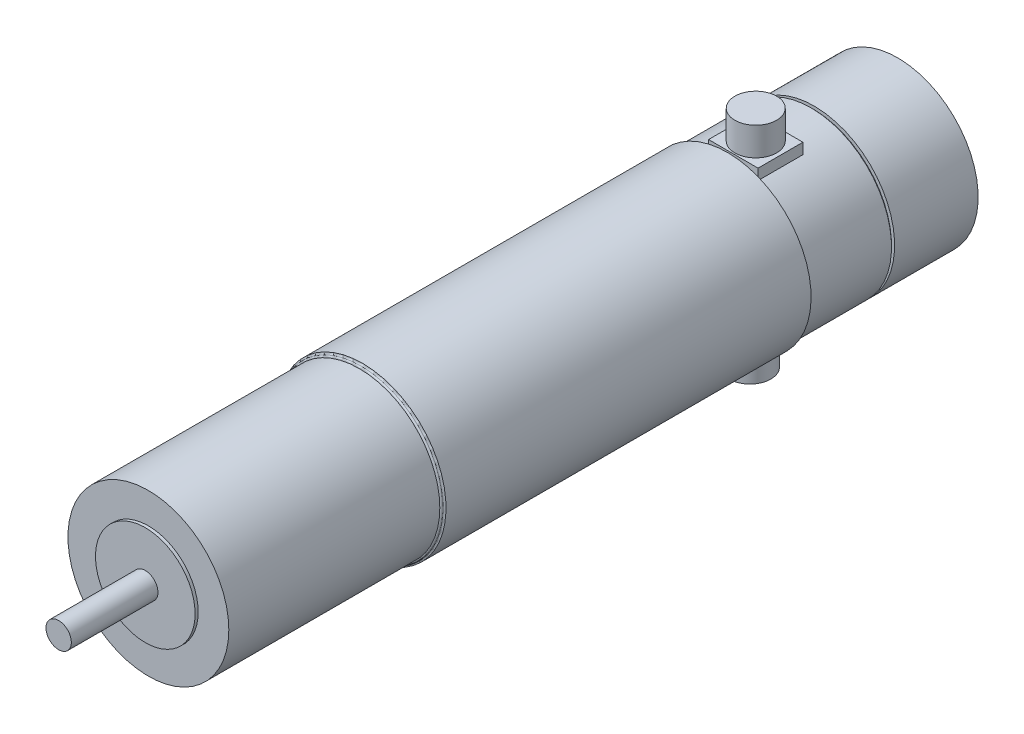
ISO-10303-21;
HEADER;
FILE_DESCRIPTION(('STEP AP214'),'2;1');
FILE_NAME('part.step','',(''),(''),'','','');
FILE_SCHEMA(('AUTOMOTIVE_DESIGN { 1 0 10303 214 1 1 1 1 }'));
ENDSEC;
DATA;
#1=APPLICATION_CONTEXT('core data for automotive mechanical design processes');
#2=APPLICATION_PROTOCOL_DEFINITION('international standard','automotive_design',2000,#1);
#3=PRODUCT_CONTEXT('',#1,'mechanical');
#4=PRODUCT('Part','Part','',(#3));
#5=PRODUCT_RELATED_PRODUCT_CATEGORY('part','',(#4));
#6=PRODUCT_DEFINITION_FORMATION('','',#4);
#7=PRODUCT_DEFINITION_CONTEXT('part definition',#1,'design');
#8=PRODUCT_DEFINITION('design','',#6,#7);
#9=PRODUCT_DEFINITION_SHAPE('','',#8);
#10=(LENGTH_UNIT() NAMED_UNIT(*) SI_UNIT(.MILLI.,.METRE.));
#11=(NAMED_UNIT(*) PLANE_ANGLE_UNIT() SI_UNIT($,.RADIAN.));
#12=(NAMED_UNIT(*) SI_UNIT($,.STERADIAN.) SOLID_ANGLE_UNIT());
#13=UNCERTAINTY_MEASURE_WITH_UNIT(LENGTH_MEASURE(1.E-05),#10,'distance_accuracy_value','');
#14=(GEOMETRIC_REPRESENTATION_CONTEXT(3) GLOBAL_UNCERTAINTY_ASSIGNED_CONTEXT((#13)) GLOBAL_UNIT_ASSIGNED_CONTEXT((#10,
#11,#12)) REPRESENTATION_CONTEXT('',''));
#15=CARTESIAN_POINT('',(0.,0.,0.));
#16=DIRECTION('',(0.,0.,1.));
#17=DIRECTION('',(1.,0.,0.));
#18=AXIS2_PLACEMENT_3D('',#15,#16,#17);
#19=CARTESIAN_POINT('',(0.,0.,-153.1));
#20=DIRECTION('',(0.,0.,-1.));
#21=DIRECTION('',(-1.,0.,0.));
#22=AXIS2_PLACEMENT_3D('',#19,#20,#21);
#23=PLANE('',#22);
#24=CARTESIAN_POINT('',(0.,0.,-153.1));
#25=DIRECTION('',(0.,0.,-1.));
#26=DIRECTION('',(-1.,0.,0.));
#27=AXIS2_PLACEMENT_3D('',#24,#25,#26);
#28=CIRCLE('',#27,27.);
#29=CARTESIAN_POINT('',(9.86076186383501,25.1349433153277,-153.1));
#30=VERTEX_POINT('',#29);
#31=CARTESIAN_POINT('',(8.00000000000002,-25.7875939164552,-153.1));
#32=VERTEX_POINT('',#31);
#33=EDGE_CURVE('E207',#30,#32,#28,.T.);
#34=ORIENTED_EDGE('',*,*,#33,.T.);
#35=DIRECTION('',(0.,-1.,0.));
#36=VECTOR('',#35,1.);
#37=CARTESIAN_POINT('',(8.00000000000002,27.552,-153.1));
#38=LINE('',#37,#36);
#39=CARTESIAN_POINT('',(8.00000000000002,-24.738633753706,-153.1));
#40=VERTEX_POINT('',#39);
#41=EDGE_CURVE('E512',#40,#32,#38,.T.);
#42=ORIENTED_EDGE('',*,*,#41,.F.);
#43=CARTESIAN_POINT('',(0.,0.,-153.1));
#44=DIRECTION('',(0.,0.,-1.));
#45=DIRECTION('',(-1.,0.,0.));
#46=AXIS2_PLACEMENT_3D('',#43,#44,#45);
#47=CIRCLE('',#46,26.);
#48=CARTESIAN_POINT('',(9.860761863835,24.0575430055677,-153.1));
#49=VERTEX_POINT('',#48);
#50=EDGE_CURVE('E198',#49,#40,#47,.T.);
#51=ORIENTED_EDGE('',*,*,#50,.F.);
#52=DIRECTION('',(0.,1.,0.));
#53=VECTOR('',#52,1.);
#54=CARTESIAN_POINT('',(9.86076186383501,-27.001,-153.1));
#55=LINE('',#54,#53);
#56=EDGE_CURVE('E176',#49,#30,#55,.T.);
#57=ORIENTED_EDGE('',*,*,#56,.T.);
#58=EDGE_LOOP('',(#34,#42,#51,#57));
#59=FACE_BOUND('',#58,.T.);
#60=ADVANCED_FACE('F36',(#59),#23,.T.);
#61=CARTESIAN_POINT('',(-7.99999999999999,-24.738633753706,-153.1));
#62=VERTEX_POINT('',#61);
#63=CARTESIAN_POINT('',(-6.13923813616499,25.2647927976356,-153.1));
#64=VERTEX_POINT('',#63);
#65=EDGE_CURVE('E203',#62,#64,#47,.T.);
#66=ORIENTED_EDGE('',*,*,#65,.F.);
#67=DIRECTION('',(0.,-1.,0.));
#68=VECTOR('',#67,1.);
#69=CARTESIAN_POINT('',(-7.99999999999999,27.552,-153.1));
#70=LINE('',#69,#68);
#71=CARTESIAN_POINT('',(-7.99999999999999,-25.7875939164553,-153.1));
#72=VERTEX_POINT('',#71);
#73=EDGE_CURVE('E53',#62,#72,#70,.T.);
#74=ORIENTED_EDGE('',*,*,#73,.T.);
#75=CARTESIAN_POINT('',(-6.13923813616499,26.2927700158705,-153.1));
#76=VERTEX_POINT('',#75);
#77=EDGE_CURVE('E208',#72,#76,#28,.T.);
#78=ORIENTED_EDGE('',*,*,#77,.T.);
#79=DIRECTION('',(0.,1.,0.));
#80=VECTOR('',#79,1.);
#81=CARTESIAN_POINT('',(-6.13923813616499,-27.001,-153.1));
#82=LINE('',#81,#80);
#83=EDGE_CURVE('E180',#64,#76,#82,.T.);
#84=ORIENTED_EDGE('',*,*,#83,.F.);
#85=EDGE_LOOP('',(#66,#74,#78,#84));
#86=FACE_BOUND('',#85,.T.);
#87=ADVANCED_FACE('F260',(#86),#23,.T.);
#88=CARTESIAN_POINT('',(0.,0.,-180.1));
#89=DIRECTION('',(0.,0.,1.));
#90=DIRECTION('',(1.,0.,0.));
#91=AXIS2_PLACEMENT_3D('',#88,#89,#90);
#92=CYLINDRICAL_SURFACE('',#91,26.);
#93=CARTESIAN_POINT('',(0.,0.,-180.1));
#94=DIRECTION('',(0.,0.,-1.));
#95=DIRECTION('',(-1.,0.,0.));
#96=AXIS2_PLACEMENT_3D('',#93,#94,#95);
#97=CIRCLE('',#96,26.);
#98=CARTESIAN_POINT('',(-26.,0.,-180.1));
#99=VERTEX_POINT('',#98);
#100=EDGE_CURVE('E195',#99,#99,#97,.T.);
#101=ORIENTED_EDGE('',*,*,#100,.F.);
#102=EDGE_LOOP('',(#101));
#103=FACE_BOUND('',#102,.T.);
#104=DIRECTION('',(0.,0.,1.));
#105=VECTOR('',#104,1.);
#106=CARTESIAN_POINT('',(8.00000000000001,-24.738633753706,-180.1));
#107=LINE('',#106,#105);
#108=CARTESIAN_POINT('',(8.00000000000001,-24.738633753706,-167.6));
#109=VERTEX_POINT('',#108);
#110=EDGE_CURVE('E122',#40,#109,#107,.F.);
#111=ORIENTED_EDGE('',*,*,#110,.T.);
#112=CARTESIAN_POINT('',(0.,0.,-167.6));
#113=DIRECTION('',(0.,0.,1.));
#114=DIRECTION('',(1.,0.,0.));
#115=AXIS2_PLACEMENT_3D('',#112,#113,#114);
#116=CIRCLE('',#115,26.);
#117=CARTESIAN_POINT('',(-7.99999999999999,-24.738633753706,-167.6));
#118=VERTEX_POINT('',#117);
#119=EDGE_CURVE('E116',#109,#118,#116,.F.);
#120=ORIENTED_EDGE('',*,*,#119,.T.);
#121=DIRECTION('',(0.,0.,1.));
#122=VECTOR('',#121,1.);
#123=CARTESIAN_POINT('',(-7.99999999999999,-24.738633753706,-180.1));
#124=LINE('',#123,#122);
#125=EDGE_CURVE('E119',#118,#62,#124,.T.);
#126=ORIENTED_EDGE('',*,*,#125,.T.);
#127=ORIENTED_EDGE('',*,*,#65,.T.);
#128=DIRECTION('',(0.,0.,1.));
#129=VECTOR('',#128,1.);
#130=CARTESIAN_POINT('',(-6.13923813616499,25.2647927976356,-180.1));
#131=LINE('',#130,#129);
#132=CARTESIAN_POINT('',(-6.13923813616499,25.2647927976356,-167.6));
#133=VERTEX_POINT('',#132);
#134=EDGE_CURVE('E155',#133,#64,#131,.T.);
#135=ORIENTED_EDGE('',*,*,#134,.F.);
#136=CARTESIAN_POINT('',(0.,0.,-167.6));
#137=DIRECTION('',(0.,0.,-1.));
#138=DIRECTION('',(-1.,0.,0.));
#139=AXIS2_PLACEMENT_3D('',#136,#137,#138);
#140=CIRCLE('',#139,26.);
#141=CARTESIAN_POINT('',(9.860761863835,24.0575430055677,-167.6));
#142=VERTEX_POINT('',#141);
#143=EDGE_CURVE('E159',#142,#133,#140,.F.);
#144=ORIENTED_EDGE('',*,*,#143,.F.);
#145=DIRECTION('',(0.,0.,1.));
#146=VECTOR('',#145,1.);
#147=CARTESIAN_POINT('',(9.860761863835,24.0575430055677,-180.1));
#148=LINE('',#147,#146);
#149=EDGE_CURVE('E158',#49,#142,#148,.F.);
#150=ORIENTED_EDGE('',*,*,#149,.F.);
#151=ORIENTED_EDGE('',*,*,#50,.T.);
#152=EDGE_LOOP('',(#111,#120,#126,#127,#135,#144,#150,#151));
#153=FACE_BOUND('',#152,.T.);
#154=ADVANCED_FACE('F118',(#103,#153),#92,.T.);
#155=CARTESIAN_POINT('',(0.,0.,34.1));
#156=DIRECTION('',(0.,0.,-1.));
#157=DIRECTION('',(-1.,0.,0.));
#158=AXIS2_PLACEMENT_3D('',#155,#156,#157);
#159=CYLINDRICAL_SURFACE('',#158,26.);
#160=CARTESIAN_POINT('',(0.,0.,34.1));
#161=DIRECTION('',(0.,0.,1.));
#162=DIRECTION('',(1.,0.,0.));
#163=AXIS2_PLACEMENT_3D('',#160,#161,#162);
#164=CIRCLE('',#163,26.);
#165=CARTESIAN_POINT('',(26.,0.,34.1));
#166=VERTEX_POINT('',#165);
#167=EDGE_CURVE('E221',#166,#166,#164,.T.);
#168=ORIENTED_EDGE('',*,*,#167,.F.);
#169=EDGE_LOOP('',(#168));
#170=FACE_BOUND('',#169,.T.);
#171=CARTESIAN_POINT('',(0.,0.,-34.1));
#172=DIRECTION('',(0.,0.,1.));
#173=DIRECTION('',(1.,0.,0.));
#174=AXIS2_PLACEMENT_3D('',#171,#172,#173);
#175=CIRCLE('',#174,26.);
#176=CARTESIAN_POINT('',(26.,0.,-34.1));
#177=VERTEX_POINT('',#176);
#178=EDGE_CURVE('E206',#177,#177,#175,.T.);
#179=ORIENTED_EDGE('',*,*,#178,.T.);
#180=EDGE_LOOP('',(#179));
#181=FACE_BOUND('',#180,.T.);
#182=ADVANCED_FACE('F292',(#170,#181),#159,.T.);
#183=CARTESIAN_POINT('',(0.,0.,34.1));
#184=DIRECTION('',(0.,0.,1.));
#185=DIRECTION('',(1.,0.,0.));
#186=AXIS2_PLACEMENT_3D('',#183,#184,#185);
#187=PLANE('',#186);
#188=CARTESIAN_POINT('',(0.,0.,34.1));
#189=DIRECTION('',(0.,0.,1.));
#190=DIRECTION('',(1.,0.,0.));
#191=AXIS2_PLACEMENT_3D('',#188,#189,#190);
#192=CIRCLE('',#191,16.098);
#193=CARTESIAN_POINT('',(16.098,0.,34.1));
#194=VERTEX_POINT('',#193);
#195=EDGE_CURVE('E218',#194,#194,#192,.T.);
#196=ORIENTED_EDGE('',*,*,#195,.F.);
#197=EDGE_LOOP('',(#196));
#198=FACE_BOUND('',#197,.T.);
#199=ORIENTED_EDGE('',*,*,#167,.T.);
#200=EDGE_LOOP('',(#199));
#201=FACE_BOUND('',#200,.T.);
#202=ADVANCED_FACE('F288',(#198,#201),#187,.T.);
#203=CARTESIAN_POINT('',(0.,0.,35.1));
#204=DIRECTION('',(0.,0.,-1.));
#205=DIRECTION('',(-1.,0.,0.));
#206=AXIS2_PLACEMENT_3D('',#203,#204,#205);
#207=CYLINDRICAL_SURFACE('',#206,16.098);
#208=CARTESIAN_POINT('',(0.,0.,35.1));
#209=DIRECTION('',(0.,0.,1.));
#210=DIRECTION('',(1.,0.,0.));
#211=AXIS2_PLACEMENT_3D('',#208,#209,#210);
#212=CIRCLE('',#211,16.098);
#213=CARTESIAN_POINT('',(16.098,0.,35.1));
#214=VERTEX_POINT('',#213);
#215=EDGE_CURVE('E214',#214,#214,#212,.T.);
#216=ORIENTED_EDGE('',*,*,#215,.F.);
#217=EDGE_LOOP('',(#216));
#218=FACE_BOUND('',#217,.T.);
#219=ORIENTED_EDGE('',*,*,#195,.T.);
#220=EDGE_LOOP('',(#219));
#221=FACE_BOUND('',#220,.T.);
#222=ADVANCED_FACE('F284',(#218,#221),#207,.T.);
#223=CARTESIAN_POINT('',(0.,0.,35.1));
#224=DIRECTION('',(0.,0.,1.));
#225=DIRECTION('',(1.,0.,0.));
#226=AXIS2_PLACEMENT_3D('',#223,#224,#225);
#227=PLANE('',#226);
#228=CARTESIAN_POINT('',(0.,0.,35.1));
#229=DIRECTION('',(0.,0.,1.));
#230=DIRECTION('',(1.,0.,0.));
#231=AXIS2_PLACEMENT_3D('',#228,#229,#230);
#232=CIRCLE('',#231,4.09800000000001);
#233=CARTESIAN_POINT('',(4.09800000000001,0.,35.1));
#234=VERTEX_POINT('',#233);
#235=EDGE_CURVE('E215',#234,#234,#232,.T.);
#236=ORIENTED_EDGE('',*,*,#235,.F.);
#237=EDGE_LOOP('',(#236));
#238=FACE_BOUND('',#237,.T.);
#239=ORIENTED_EDGE('',*,*,#215,.T.);
#240=EDGE_LOOP('',(#239));
#241=FACE_BOUND('',#240,.T.);
#242=ADVANCED_FACE('F280',(#238,#241),#227,.T.);
#243=CARTESIAN_POINT('',(0.,0.,63.1));
#244=DIRECTION('',(0.,0.,-1.));
#245=DIRECTION('',(-1.,0.,0.));
#246=AXIS2_PLACEMENT_3D('',#243,#244,#245);
#247=CYLINDRICAL_SURFACE('',#246,4.09800000000001);
#248=CARTESIAN_POINT('',(0.,0.,63.1));
#249=DIRECTION('',(0.,0.,1.));
#250=DIRECTION('',(1.,0.,0.));
#251=AXIS2_PLACEMENT_3D('',#248,#249,#250);
#252=CIRCLE('',#251,4.09800000000001);
#253=CARTESIAN_POINT('',(4.09800000000001,0.,63.1));
#254=VERTEX_POINT('',#253);
#255=EDGE_CURVE('E211',#254,#254,#252,.T.);
#256=ORIENTED_EDGE('',*,*,#255,.F.);
#257=EDGE_LOOP('',(#256));
#258=FACE_BOUND('',#257,.T.);
#259=ORIENTED_EDGE('',*,*,#235,.T.);
#260=EDGE_LOOP('',(#259));
#261=FACE_BOUND('',#260,.T.);
#262=ADVANCED_FACE('F276',(#258,#261),#247,.T.);
#263=CARTESIAN_POINT('',(0.,0.,63.1));
#264=DIRECTION('',(0.,0.,1.));
#265=DIRECTION('',(1.,0.,0.));
#266=AXIS2_PLACEMENT_3D('',#263,#264,#265);
#267=PLANE('',#266);
#268=ORIENTED_EDGE('',*,*,#255,.T.);
#269=EDGE_LOOP('',(#268));
#270=FACE_BOUND('',#269,.T.);
#271=ADVANCED_FACE('F273',(#270),#267,.T.);
#272=CARTESIAN_POINT('',(0.,0.,-153.1));
#273=DIRECTION('',(0.,0.,1.));
#274=DIRECTION('',(1.,0.,0.));
#275=AXIS2_PLACEMENT_3D('',#272,#273,#274);
#276=CYLINDRICAL_SURFACE('',#275,27.);
#277=EDGE_CURVE('E204',#76,#30,#28,.T.);
#278=ORIENTED_EDGE('',*,*,#277,.F.);
#279=ORIENTED_EDGE('',*,*,#77,.F.);
#280=CARTESIAN_POINT('',(0.,0.,-153.1));
#281=DIRECTION('',(0.,0.,-1.));
#282=DIRECTION('',(-1.,0.,0.));
#283=AXIS2_PLACEMENT_3D('',#280,#281,#282);
#284=CIRCLE('',#283,27.);
#285=EDGE_CURVE('E60',#32,#72,#284,.T.);
#286=ORIENTED_EDGE('',*,*,#285,.F.);
#287=ORIENTED_EDGE('',*,*,#33,.F.);
#288=EDGE_LOOP('',(#278,#279,#286,#287));
#289=FACE_BOUND('',#288,.T.);
#290=CARTESIAN_POINT('',(0.,0.,-35.1));
#291=DIRECTION('',(0.,0.,-1.));
#292=DIRECTION('',(-1.,0.,0.));
#293=AXIS2_PLACEMENT_3D('',#290,#291,#292);
#294=CIRCLE('',#293,27.);
#295=CARTESIAN_POINT('',(-27.,0.,-35.1));
#296=VERTEX_POINT('',#295);
#297=EDGE_CURVE('E201',#296,#296,#294,.T.);
#298=ORIENTED_EDGE('',*,*,#297,.T.);
#299=EDGE_LOOP('',(#298));
#300=FACE_BOUND('',#299,.T.);
#301=ADVANCED_FACE('F269',(#289,#300),#276,.T.);
#302=CARTESIAN_POINT('',(0.,0.,-180.1));
#303=DIRECTION('',(0.,0.,-1.));
#304=DIRECTION('',(-1.,0.,0.));
#305=AXIS2_PLACEMENT_3D('',#302,#303,#304);
#306=PLANE('',#305);
#307=CARTESIAN_POINT('',(0.,0.,-180.1));
#308=DIRECTION('',(0.,0.,-1.));
#309=DIRECTION('',(-1.,0.,0.));
#310=AXIS2_PLACEMENT_3D('',#307,#308,#309);
#311=CIRCLE('',#310,25.5);
#312=CARTESIAN_POINT('',(-25.5,0.,-180.1));
#313=VERTEX_POINT('',#312);
#314=EDGE_CURVE('E192',#313,#313,#311,.T.);
#315=ORIENTED_EDGE('',*,*,#314,.F.);
#316=EDGE_LOOP('',(#315));
#317=FACE_BOUND('',#316,.T.);
#318=ORIENTED_EDGE('',*,*,#100,.T.);
#319=EDGE_LOOP('',(#318));
#320=FACE_BOUND('',#319,.T.);
#321=ADVANCED_FACE('F272',(#317,#320),#306,.T.);
#322=CARTESIAN_POINT('',(0.,0.,-180.6));
#323=DIRECTION('',(0.,0.,1.));
#324=DIRECTION('',(1.,0.,0.));
#325=AXIS2_PLACEMENT_3D('',#322,#323,#324);
#326=CYLINDRICAL_SURFACE('',#325,25.5);
#327=CARTESIAN_POINT('',(0.,0.,-180.6));
#328=DIRECTION('',(0.,0.,-1.));
#329=DIRECTION('',(-1.,0.,0.));
#330=AXIS2_PLACEMENT_3D('',#327,#328,#329);
#331=CIRCLE('',#330,25.5);
#332=CARTESIAN_POINT('',(-25.5,0.,-180.6));
#333=VERTEX_POINT('',#332);
#334=EDGE_CURVE('E161',#333,#333,#331,.T.);
#335=ORIENTED_EDGE('',*,*,#334,.F.);
#336=EDGE_LOOP('',(#335));
#337=FACE_BOUND('',#336,.T.);
#338=ORIENTED_EDGE('',*,*,#314,.T.);
#339=EDGE_LOOP('',(#338));
#340=FACE_BOUND('',#339,.T.);
#341=ADVANCED_FACE('F328',(#337,#340),#326,.T.);
#342=CARTESIAN_POINT('',(0.,0.,-180.6));
#343=DIRECTION('',(0.,0.,-1.));
#344=DIRECTION('',(-1.,0.,0.));
#345=AXIS2_PLACEMENT_3D('',#342,#343,#344);
#346=PLANE('',#345);
#347=CARTESIAN_POINT('',(0.,0.,-180.6));
#348=DIRECTION('',(0.,0.,-1.));
#349=DIRECTION('',(-1.,0.,0.));
#350=AXIS2_PLACEMENT_3D('',#347,#348,#349);
#351=CIRCLE('',#350,13.192);
#352=CARTESIAN_POINT('',(-13.192,0.,-180.6));
#353=VERTEX_POINT('',#352);
#354=EDGE_CURVE('E189',#353,#353,#351,.T.);
#355=ORIENTED_EDGE('',*,*,#354,.F.);
#356=EDGE_LOOP('',(#355));
#357=FACE_BOUND('',#356,.T.);
#358=ORIENTED_EDGE('',*,*,#334,.T.);
#359=EDGE_LOOP('',(#358));
#360=FACE_BOUND('',#359,.T.);
#361=ADVANCED_FACE('F325',(#357,#360),#346,.T.);
#362=CARTESIAN_POINT('',(0.,0.,-182.6));
#363=DIRECTION('',(0.,0.,1.));
#364=DIRECTION('',(1.,0.,0.));
#365=AXIS2_PLACEMENT_3D('',#362,#363,#364);
#366=CYLINDRICAL_SURFACE('',#365,13.192);
#367=CARTESIAN_POINT('',(0.,0.,-181.1));
#368=DIRECTION('',(0.,0.,1.));
#369=DIRECTION('',(1.,0.,0.));
#370=AXIS2_PLACEMENT_3D('',#367,#368,#369);
#371=CIRCLE('',#370,13.192);
#372=CARTESIAN_POINT('',(13.192,0.,-181.1));
#373=VERTEX_POINT('',#372);
#374=EDGE_CURVE('E40',#373,#373,#371,.T.);
#375=ORIENTED_EDGE('',*,*,#374,.T.);
#376=EDGE_LOOP('',(#375));
#377=FACE_BOUND('',#376,.T.);
#378=ORIENTED_EDGE('',*,*,#354,.T.);
#379=EDGE_LOOP('',(#378));
#380=FACE_BOUND('',#379,.T.);
#381=ADVANCED_FACE('F233',(#377,#380),#366,.T.);
#382=CARTESIAN_POINT('',(-6.13923813616499,-27.001,-153.1));
#383=DIRECTION('',(0.,0.,1.));
#384=DIRECTION('',(1.,0.,0.));
#385=AXIS2_PLACEMENT_3D('',#382,#383,#384);
#386=PLANE('',#385);
#387=ORIENTED_EDGE('',*,*,#277,.T.);
#388=CARTESIAN_POINT('',(9.86076186383501,27.551,-153.1));
#389=VERTEX_POINT('',#388);
#390=EDGE_CURVE('E179',#30,#389,#55,.T.);
#391=ORIENTED_EDGE('',*,*,#390,.T.);
#392=DIRECTION('',(1.,0.,0.));
#393=VECTOR('',#392,1.);
#394=CARTESIAN_POINT('',(-6.13923813616499,27.551,-153.1));
#395=LINE('',#394,#393);
#396=CARTESIAN_POINT('',(-6.13923813616499,27.551,-153.1));
#397=VERTEX_POINT('',#396);
#398=EDGE_CURVE('E172',#397,#389,#395,.T.);
#399=ORIENTED_EDGE('',*,*,#398,.F.);
#400=EDGE_CURVE('E183',#76,#397,#82,.T.);
#401=ORIENTED_EDGE('',*,*,#400,.F.);
#402=EDGE_LOOP('',(#387,#391,#399,#401));
#403=FACE_BOUND('',#402,.T.);
#404=ADVANCED_FACE('F324',(#403),#386,.T.);
#405=CARTESIAN_POINT('',(0.,27.551,0.));
#406=DIRECTION('',(0.,1.,0.));
#407=DIRECTION('',(0.,0.,1.));
#408=AXIS2_PLACEMENT_3D('',#405,#406,#407);
#409=PLANE('',#408);
#410=CARTESIAN_POINT('',(1.86076186383501,27.551,-160.35));
#411=DIRECTION('',(0.,1.,0.));
#412=DIRECTION('',(0.,0.,1.));
#413=AXIS2_PLACEMENT_3D('',#410,#411,#412);
#414=CIRCLE('',#413,6.75);
#415=CARTESIAN_POINT('',(1.86076186383501,27.551,-153.6));
#416=VERTEX_POINT('',#415);
#417=EDGE_CURVE('E11',#416,#416,#414,.T.);
#418=ORIENTED_EDGE('',*,*,#417,.F.);
#419=EDGE_LOOP('',(#418));
#420=FACE_BOUND('',#419,.T.);
#421=DIRECTION('',(0.,0.,-1.));
#422=VECTOR('',#421,1.);
#423=CARTESIAN_POINT('',(9.86076186383501,27.551,-167.6));
#424=LINE('',#423,#422);
#425=CARTESIAN_POINT('',(9.86076186383501,27.551,-167.6));
#426=VERTEX_POINT('',#425);
#427=EDGE_CURVE('E162',#389,#426,#424,.T.);
#428=ORIENTED_EDGE('',*,*,#427,.T.);
#429=DIRECTION('',(-1.,0.,0.));
#430=VECTOR('',#429,1.);
#431=CARTESIAN_POINT('',(-6.13923813616499,27.551,-167.6));
#432=LINE('',#431,#430);
#433=CARTESIAN_POINT('',(-6.13923813616499,27.551,-167.6));
#434=VERTEX_POINT('',#433);
#435=EDGE_CURVE('E165',#426,#434,#432,.T.);
#436=ORIENTED_EDGE('',*,*,#435,.T.);
#437=DIRECTION('',(0.,0.,1.));
#438=VECTOR('',#437,1.);
#439=CARTESIAN_POINT('',(-6.13923813616499,27.551,-167.6));
#440=LINE('',#439,#438);
#441=EDGE_CURVE('E169',#434,#397,#440,.T.);
#442=ORIENTED_EDGE('',*,*,#441,.T.);
#443=ORIENTED_EDGE('',*,*,#398,.T.);
#444=EDGE_LOOP('',(#428,#436,#442,#443));
#445=FACE_BOUND('',#444,.T.);
#446=ADVANCED_FACE('F454',(#420,#445),#409,.T.);
#447=CARTESIAN_POINT('',(-6.13923813616499,-27.001,-167.6));
#448=DIRECTION('',(0.,0.,-1.));
#449=DIRECTION('',(-1.,0.,0.));
#450=AXIS2_PLACEMENT_3D('',#447,#448,#449);
#451=PLANE('',#450);
#452=DIRECTION('',(0.,1.,0.));
#453=VECTOR('',#452,1.);
#454=CARTESIAN_POINT('',(9.86076186383501,-27.001,-167.6));
#455=LINE('',#454,#453);
#456=EDGE_CURVE('E175',#142,#426,#455,.T.);
#457=ORIENTED_EDGE('',*,*,#456,.F.);
#458=ORIENTED_EDGE('',*,*,#143,.T.);
#459=DIRECTION('',(0.,1.,0.));
#460=VECTOR('',#459,1.);
#461=CARTESIAN_POINT('',(-6.13923813616499,-27.001,-167.6));
#462=LINE('',#461,#460);
#463=EDGE_CURVE('E184',#133,#434,#462,.T.);
#464=ORIENTED_EDGE('',*,*,#463,.T.);
#465=ORIENTED_EDGE('',*,*,#435,.F.);
#466=EDGE_LOOP('',(#457,#458,#464,#465));
#467=FACE_BOUND('',#466,.T.);
#468=ADVANCED_FACE('F317',(#467),#451,.T.);
#469=CARTESIAN_POINT('',(-6.13923813616499,-27.001,-167.6));
#470=DIRECTION('',(-1.,0.,0.));
#471=DIRECTION('',(0.,0.,1.));
#472=AXIS2_PLACEMENT_3D('',#469,#470,#471);
#473=PLANE('',#472);
#474=ORIENTED_EDGE('',*,*,#463,.F.);
#475=ORIENTED_EDGE('',*,*,#134,.T.);
#476=ORIENTED_EDGE('',*,*,#83,.T.);
#477=ORIENTED_EDGE('',*,*,#400,.T.);
#478=ORIENTED_EDGE('',*,*,#441,.F.);
#479=EDGE_LOOP('',(#474,#475,#476,#477,#478));
#480=FACE_BOUND('',#479,.T.);
#481=ADVANCED_FACE('F308',(#480),#473,.T.);
#482=CARTESIAN_POINT('',(9.86076186383501,-27.001,-167.6));
#483=DIRECTION('',(1.,0.,0.));
#484=DIRECTION('',(0.,0.,-1.));
#485=AXIS2_PLACEMENT_3D('',#482,#483,#484);
#486=PLANE('',#485);
#487=ORIENTED_EDGE('',*,*,#56,.F.);
#488=ORIENTED_EDGE('',*,*,#149,.T.);
#489=ORIENTED_EDGE('',*,*,#456,.T.);
#490=ORIENTED_EDGE('',*,*,#427,.F.);
#491=ORIENTED_EDGE('',*,*,#390,.F.);
#492=EDGE_LOOP('',(#487,#488,#489,#490,#491));
#493=FACE_BOUND('',#492,.T.);
#494=ADVANCED_FACE('F301',(#493),#486,.T.);
#495=CARTESIAN_POINT('',(0.,0.,-34.6));
#496=DIRECTION('',(0.,0.,-1.));
#497=DIRECTION('',(-1.,0.,0.));
#498=AXIS2_PLACEMENT_3D('',#495,#496,#497);
#499=TOROIDAL_SURFACE('',#498,27.,0.5);
#500=ORIENTED_EDGE('',*,*,#297,.F.);
#501=EDGE_LOOP('',(#500));
#502=FACE_BOUND('',#501,.T.);
#503=CARTESIAN_POINT('',(0.,0.,-34.6));
#504=DIRECTION('',(0.,0.,-1.));
#505=DIRECTION('',(-1.,0.,0.));
#506=AXIS2_PLACEMENT_3D('',#503,#504,#505);
#507=CIRCLE('',#506,26.5);
#508=CARTESIAN_POINT('',(-26.5,0.,-34.6));
#509=VERTEX_POINT('',#508);
#510=EDGE_CURVE('E166',#509,#509,#507,.F.);
#511=ORIENTED_EDGE('',*,*,#510,.F.);
#512=EDGE_LOOP('',(#511));
#513=FACE_BOUND('',#512,.T.);
#514=ADVANCED_FACE('F38',(#502,#513),#499,.F.);
#515=CARTESIAN_POINT('',(0.,0.,-34.6));
#516=DIRECTION('',(0.,0.,-1.));
#517=DIRECTION('',(-1.,0.,0.));
#518=AXIS2_PLACEMENT_3D('',#515,#516,#517);
#519=TOROIDAL_SURFACE('',#518,26.,0.5);
#520=ORIENTED_EDGE('',*,*,#178,.F.);
#521=EDGE_LOOP('',(#520));
#522=FACE_BOUND('',#521,.T.);
#523=ORIENTED_EDGE('',*,*,#510,.T.);
#524=EDGE_LOOP('',(#523));
#525=FACE_BOUND('',#524,.T.);
#526=ADVANCED_FACE('F246',(#522,#525),#519,.T.);
#527=CARTESIAN_POINT('',(0.,0.,-181.1));
#528=DIRECTION('',(0.,0.,-1.));
#529=DIRECTION('',(-1.,0.,0.));
#530=AXIS2_PLACEMENT_3D('',#527,#528,#529);
#531=CYLINDRICAL_SURFACE('',#530,26.);
#532=CARTESIAN_POINT('',(0.,0.,-181.1));
#533=DIRECTION('',(0.,0.,-1.));
#534=DIRECTION('',(-1.,0.,0.));
#535=AXIS2_PLACEMENT_3D('',#532,#533,#534);
#536=CIRCLE('',#535,26.);
#537=CARTESIAN_POINT('',(-26.,0.,-181.1));
#538=VERTEX_POINT('',#537);
#539=EDGE_CURVE('E150',#538,#538,#536,.T.);
#540=ORIENTED_EDGE('',*,*,#539,.T.);
#541=EDGE_LOOP('',(#540));
#542=FACE_BOUND('',#541,.T.);
#543=CARTESIAN_POINT('',(0.,0.,-208.1));
#544=DIRECTION('',(0.,0.,-1.));
#545=DIRECTION('',(-1.,0.,0.));
#546=AXIS2_PLACEMENT_3D('',#543,#544,#545);
#547=CIRCLE('',#546,26.);
#548=CARTESIAN_POINT('',(-26.,0.,-208.1));
#549=VERTEX_POINT('',#548);
#550=EDGE_CURVE('E149',#549,#549,#547,.T.);
#551=ORIENTED_EDGE('',*,*,#550,.F.);
#552=EDGE_LOOP('',(#551));
#553=FACE_BOUND('',#552,.T.);
#554=ADVANCED_FACE('F240',(#542,#553),#531,.T.);
#555=CARTESIAN_POINT('',(0.,0.,-181.1));
#556=DIRECTION('',(0.,0.,1.));
#557=DIRECTION('',(-1.,0.,0.));
#558=AXIS2_PLACEMENT_3D('',#555,#556,#557);
#559=PLANE('',#558);
#560=ORIENTED_EDGE('',*,*,#374,.F.);
#561=EDGE_LOOP('',(#560));
#562=FACE_BOUND('',#561,.T.);
#563=ORIENTED_EDGE('',*,*,#539,.F.);
#564=EDGE_LOOP('',(#563));
#565=FACE_BOUND('',#564,.T.);
#566=ADVANCED_FACE('F236',(#562,#565),#559,.T.);
#567=CARTESIAN_POINT('',(0.,0.,-208.1));
#568=DIRECTION('',(0.,0.,1.));
#569=DIRECTION('',(-1.,0.,0.));
#570=AXIS2_PLACEMENT_3D('',#567,#568,#569);
#571=PLANE('',#570);
#572=ORIENTED_EDGE('',*,*,#550,.T.);
#573=EDGE_LOOP('',(#572));
#574=FACE_BOUND('',#573,.T.);
#575=ADVANCED_FACE('F239',(#574),#571,.F.);
#576=CARTESIAN_POINT('',(-7.99999999999999,27.552,-153.1));
#577=DIRECTION('',(0.,0.,-1.));
#578=DIRECTION('',(-1.,0.,0.));
#579=AXIS2_PLACEMENT_3D('',#576,#577,#578);
#580=PLANE('',#579);
#581=CARTESIAN_POINT('',(8.00000000000002,-27.551,-153.1));
#582=VERTEX_POINT('',#581);
#583=EDGE_CURVE('E502',#32,#582,#38,.T.);
#584=ORIENTED_EDGE('',*,*,#583,.F.);
#585=ORIENTED_EDGE('',*,*,#285,.T.);
#586=CARTESIAN_POINT('',(-7.99999999999999,-27.551,-153.1));
#587=VERTEX_POINT('',#586);
#588=EDGE_CURVE('E140',#72,#587,#70,.T.);
#589=ORIENTED_EDGE('',*,*,#588,.T.);
#590=DIRECTION('',(1.,0.,0.));
#591=VECTOR('',#590,1.);
#592=CARTESIAN_POINT('',(-7.99999999999999,-27.551,-153.1));
#593=LINE('',#592,#591);
#594=EDGE_CURVE('E147',#587,#582,#593,.T.);
#595=ORIENTED_EDGE('',*,*,#594,.T.);
#596=EDGE_LOOP('',(#584,#585,#589,#595));
#597=FACE_BOUND('',#596,.T.);
#598=ADVANCED_FACE('F251',(#597),#580,.F.);
#599=CARTESIAN_POINT('',(8.00000000000001,27.552,-167.6));
#600=DIRECTION('',(-1.,0.,0.));
#601=DIRECTION('',(0.,0.,1.));
#602=AXIS2_PLACEMENT_3D('',#599,#600,#601);
#603=PLANE('',#602);
#604=ORIENTED_EDGE('',*,*,#110,.F.);
#605=ORIENTED_EDGE('',*,*,#41,.T.);
#606=ORIENTED_EDGE('',*,*,#583,.T.);
#607=DIRECTION('',(0.,0.,-1.));
#608=VECTOR('',#607,1.);
#609=CARTESIAN_POINT('',(8.00000000000001,-27.551,-167.6));
#610=LINE('',#609,#608);
#611=CARTESIAN_POINT('',(8.00000000000001,-27.551,-167.6));
#612=VERTEX_POINT('',#611);
#613=EDGE_CURVE('E509',#582,#612,#610,.T.);
#614=ORIENTED_EDGE('',*,*,#613,.T.);
#615=DIRECTION('',(0.,-1.,0.));
#616=VECTOR('',#615,1.);
#617=CARTESIAN_POINT('',(8.00000000000001,27.552,-167.6));
#618=LINE('',#617,#616);
#619=EDGE_CURVE('E142',#109,#612,#618,.T.);
#620=ORIENTED_EDGE('',*,*,#619,.F.);
#621=EDGE_LOOP('',(#604,#605,#606,#614,#620));
#622=FACE_BOUND('',#621,.T.);
#623=ADVANCED_FACE('F256',(#622),#603,.F.);
#624=CARTESIAN_POINT('',(-7.99999999999999,27.552,-167.6));
#625=DIRECTION('',(0.,0.,1.));
#626=DIRECTION('',(1.,0.,0.));
#627=AXIS2_PLACEMENT_3D('',#624,#625,#626);
#628=PLANE('',#627);
#629=ORIENTED_EDGE('',*,*,#119,.F.);
#630=ORIENTED_EDGE('',*,*,#619,.T.);
#631=DIRECTION('',(-1.,0.,0.));
#632=VECTOR('',#631,1.);
#633=CARTESIAN_POINT('',(-7.99999999999999,-27.551,-167.6));
#634=LINE('',#633,#632);
#635=CARTESIAN_POINT('',(-7.99999999999999,-27.551,-167.6));
#636=VERTEX_POINT('',#635);
#637=EDGE_CURVE('E136',#612,#636,#634,.T.);
#638=ORIENTED_EDGE('',*,*,#637,.T.);
#639=DIRECTION('',(0.,-1.,0.));
#640=VECTOR('',#639,1.);
#641=CARTESIAN_POINT('',(-7.99999999999999,27.552,-167.6));
#642=LINE('',#641,#640);
#643=EDGE_CURVE('E130',#118,#636,#642,.T.);
#644=ORIENTED_EDGE('',*,*,#643,.F.);
#645=EDGE_LOOP('',(#629,#630,#638,#644));
#646=FACE_BOUND('',#645,.T.);
#647=ADVANCED_FACE('F134',(#646),#628,.F.);
#648=CARTESIAN_POINT('',(-7.99999999999999,27.552,-167.6));
#649=DIRECTION('',(1.,0.,0.));
#650=DIRECTION('',(0.,0.,-1.));
#651=AXIS2_PLACEMENT_3D('',#648,#649,#650);
#652=PLANE('',#651);
#653=ORIENTED_EDGE('',*,*,#125,.F.);
#654=ORIENTED_EDGE('',*,*,#643,.T.);
#655=DIRECTION('',(0.,0.,1.));
#656=VECTOR('',#655,1.);
#657=CARTESIAN_POINT('',(-7.99999999999999,-27.551,-167.6));
#658=LINE('',#657,#656);
#659=EDGE_CURVE('E138',#636,#587,#658,.T.);
#660=ORIENTED_EDGE('',*,*,#659,.T.);
#661=ORIENTED_EDGE('',*,*,#588,.F.);
#662=ORIENTED_EDGE('',*,*,#73,.F.);
#663=EDGE_LOOP('',(#653,#654,#660,#661,#662));
#664=FACE_BOUND('',#663,.T.);
#665=ADVANCED_FACE('F128',(#664),#652,.F.);
#666=CARTESIAN_POINT('',(0.,-27.551,0.));
#667=DIRECTION('',(0.,1.,0.));
#668=DIRECTION('',(0.,0.,1.));
#669=AXIS2_PLACEMENT_3D('',#666,#667,#668);
#670=PLANE('',#669);
#671=CARTESIAN_POINT('',(0.,-27.551,-160.35));
#672=DIRECTION('',(0.,-1.,0.));
#673=DIRECTION('',(0.,0.,-1.));
#674=AXIS2_PLACEMENT_3D('',#671,#672,#673);
#675=CIRCLE('',#674,6.75);
#676=CARTESIAN_POINT('',(0.,-27.551,-167.1));
#677=VERTEX_POINT('',#676);
#678=EDGE_CURVE('E45',#677,#677,#675,.T.);
#679=ORIENTED_EDGE('',*,*,#678,.F.);
#680=EDGE_LOOP('',(#679));
#681=FACE_BOUND('',#680,.T.);
#682=ORIENTED_EDGE('',*,*,#613,.F.);
#683=ORIENTED_EDGE('',*,*,#594,.F.);
#684=ORIENTED_EDGE('',*,*,#659,.F.);
#685=ORIENTED_EDGE('',*,*,#637,.F.);
#686=EDGE_LOOP('',(#682,#683,#684,#685));
#687=FACE_BOUND('',#686,.T.);
#688=ADVANCED_FACE('F415',(#681,#687),#670,.F.);
#689=CARTESIAN_POINT('',(0.,-36.695,-160.35));
#690=DIRECTION('',(0.,1.,0.));
#691=DIRECTION('',(0.,0.,1.));
#692=AXIS2_PLACEMENT_3D('',#689,#690,#691);
#693=CYLINDRICAL_SURFACE('',#692,6.75);
#694=CARTESIAN_POINT('',(0.,-36.695,-160.35));
#695=DIRECTION('',(0.,-1.,0.));
#696=DIRECTION('',(0.,0.,-1.));
#697=AXIS2_PLACEMENT_3D('',#694,#695,#696);
#698=CIRCLE('',#697,6.75);
#699=CARTESIAN_POINT('',(0.,-36.695,-167.1));
#700=VERTEX_POINT('',#699);
#701=EDGE_CURVE('E499',#700,#700,#698,.T.);
#702=ORIENTED_EDGE('',*,*,#701,.F.);
#703=EDGE_LOOP('',(#702));
#704=FACE_BOUND('',#703,.T.);
#705=ORIENTED_EDGE('',*,*,#678,.T.);
#706=EDGE_LOOP('',(#705));
#707=FACE_BOUND('',#706,.T.);
#708=ADVANCED_FACE('F425',(#704,#707),#693,.T.);
#709=CARTESIAN_POINT('',(0.,-36.695,-160.35));
#710=DIRECTION('',(0.,-1.,0.));
#711=DIRECTION('',(0.,0.,-1.));
#712=AXIS2_PLACEMENT_3D('',#709,#710,#711);
#713=PLANE('',#712);
#714=ORIENTED_EDGE('',*,*,#701,.T.);
#715=EDGE_LOOP('',(#714));
#716=FACE_BOUND('',#715,.T.);
#717=ADVANCED_FACE('F437',(#716),#713,.T.);
#718=CARTESIAN_POINT('',(1.86076186383501,36.695,-160.35));
#719=DIRECTION('',(0.,-1.,0.));
#720=DIRECTION('',(0.,0.,-1.));
#721=AXIS2_PLACEMENT_3D('',#718,#719,#720);
#722=CYLINDRICAL_SURFACE('',#721,6.75);
#723=CARTESIAN_POINT('',(1.86076186383501,36.695,-160.35));
#724=DIRECTION('',(0.,1.,0.));
#725=DIRECTION('',(0.,0.,1.));
#726=AXIS2_PLACEMENT_3D('',#723,#724,#725);
#727=CIRCLE('',#726,6.75);
#728=CARTESIAN_POINT('',(1.86076186383501,36.695,-153.6));
#729=VERTEX_POINT('',#728);
#730=EDGE_CURVE('E498',#729,#729,#727,.T.);
#731=ORIENTED_EDGE('',*,*,#730,.F.);
#732=EDGE_LOOP('',(#731));
#733=FACE_BOUND('',#732,.T.);
#734=ORIENTED_EDGE('',*,*,#417,.T.);
#735=EDGE_LOOP('',(#734));
#736=FACE_BOUND('',#735,.T.);
#737=ADVANCED_FACE('F447',(#733,#736),#722,.T.);
#738=CARTESIAN_POINT('',(1.86076186383501,36.695,-160.35));
#739=DIRECTION('',(0.,1.,0.));
#740=DIRECTION('',(0.,0.,1.));
#741=AXIS2_PLACEMENT_3D('',#738,#739,#740);
#742=PLANE('',#741);
#743=ORIENTED_EDGE('',*,*,#730,.T.);
#744=EDGE_LOOP('',(#743));
#745=FACE_BOUND('',#744,.T.);
#746=ADVANCED_FACE('F473',(#745),#742,.T.);
#747=CLOSED_SHELL('',(#60,#87,#154,#182,#202,#222,#242,#262,#271,#301,#321,#341,#361,#381,#404,
#446,#468,#481,#494,#514,#526,#554,#566,#575,#598,#623,#647,#665,#688,#708,#717,#737,#746));
#748=MANIFOLD_SOLID_BREP('B2',#747);
#749=ADVANCED_BREP_SHAPE_REPRESENTATION('',(#18,#748),#14);
#750=SHAPE_DEFINITION_REPRESENTATION(#9,#749);
ENDSEC;
END-ISO-10303-21;
